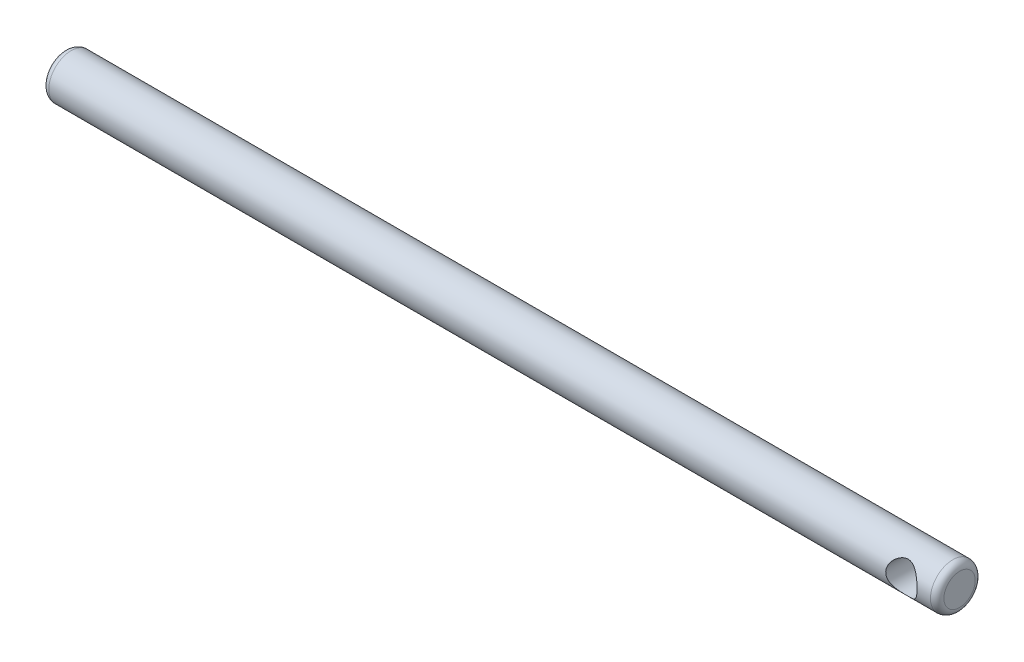
ISO-10303-21;
HEADER;
FILE_DESCRIPTION(('STEP AP214'),'2;1');
FILE_NAME('part.step','',(''),(''),'','','');
FILE_SCHEMA(('AUTOMOTIVE_DESIGN { 1 0 10303 214 1 1 1 1 }'));
ENDSEC;
DATA;
#1=APPLICATION_CONTEXT('core data for automotive mechanical design processes');
#2=APPLICATION_PROTOCOL_DEFINITION('international standard','automotive_design',2000,#1);
#3=PRODUCT_CONTEXT('',#1,'mechanical');
#4=PRODUCT('Part','Part','',(#3));
#5=PRODUCT_RELATED_PRODUCT_CATEGORY('part','',(#4));
#6=PRODUCT_DEFINITION_FORMATION('','',#4);
#7=PRODUCT_DEFINITION_CONTEXT('part definition',#1,'design');
#8=PRODUCT_DEFINITION('design','',#6,#7);
#9=PRODUCT_DEFINITION_SHAPE('','',#8);
#10=(LENGTH_UNIT() NAMED_UNIT(*) SI_UNIT(.MILLI.,.METRE.));
#11=(NAMED_UNIT(*) PLANE_ANGLE_UNIT() SI_UNIT($,.RADIAN.));
#12=(NAMED_UNIT(*) SI_UNIT($,.STERADIAN.) SOLID_ANGLE_UNIT());
#13=UNCERTAINTY_MEASURE_WITH_UNIT(LENGTH_MEASURE(1.E-05),#10,'distance_accuracy_value','');
#14=(GEOMETRIC_REPRESENTATION_CONTEXT(3) GLOBAL_UNCERTAINTY_ASSIGNED_CONTEXT((#13)) GLOBAL_UNIT_ASSIGNED_CONTEXT((#10,
#11,#12)) REPRESENTATION_CONTEXT('',''));
#15=CARTESIAN_POINT('',(0.,0.,0.));
#16=DIRECTION('',(0.,0.,1.));
#17=DIRECTION('',(1.,0.,0.));
#18=AXIS2_PLACEMENT_3D('',#15,#16,#17);
#19=CARTESIAN_POINT('',(0.,0.,0.));
#20=DIRECTION('',(1.,0.,0.));
#21=DIRECTION('',(0.,1.,0.));
#22=AXIS2_PLACEMENT_3D('',#19,#20,#21);
#23=PLANE('',#22);
#24=CARTESIAN_POINT('',(0.,0.,0.));
#25=DIRECTION('',(1.,0.,0.));
#26=DIRECTION('',(0.,1.,0.));
#27=AXIS2_PLACEMENT_3D('',#24,#25,#26);
#28=CIRCLE('',#27,1.75);
#29=CARTESIAN_POINT('',(0.,1.75,0.));
#30=VERTEX_POINT('',#29);
#31=EDGE_CURVE('E51',#30,#30,#28,.T.);
#32=ORIENTED_EDGE('',*,*,#31,.T.);
#33=EDGE_LOOP('',(#32));
#34=FACE_BOUND('',#33,.T.);
#35=ADVANCED_FACE('F35',(#34),#23,.T.);
#36=CARTESIAN_POINT('',(0.,0.,0.));
#37=DIRECTION('',(1.,0.,0.));
#38=DIRECTION('',(0.,1.,0.));
#39=AXIS2_PLACEMENT_3D('',#36,#37,#38);
#40=CYLINDRICAL_SURFACE('',#39,2.5);
#41=CARTESIAN_POINT('',(-4.,-1.79446371347731,-1.74066078861254));
#42=CARTESIAN_POINT('',(-4.08400098508107,-1.79446056427981,-1.74066741532368));
#43=CARTESIAN_POINT('',(-4.16802043931462,-1.78851332237279,-1.74685870961394));
#44=CARTESIAN_POINT('',(-4.33294383729901,-1.76526971947014,-1.77033136062981));
#45=CARTESIAN_POINT('',(-4.4138404296418,-1.74794812493775,-1.78763737302584));
#46=CARTESIAN_POINT('',(-4.56951493609264,-1.70339577608875,-1.83012791171065));
#47=CARTESIAN_POINT('',(-4.64435042320692,-1.67627625136594,-1.85522357363044));
#48=CARTESIAN_POINT('',(-4.78813317548125,-1.61315340674523,-1.9103643650963));
#49=CARTESIAN_POINT('',(-4.85708003011587,-1.57714946815069,-1.94040983929108));
#50=CARTESIAN_POINT('',(-5.00034781373763,-1.48990498728291,-2.00841970521982));
#51=CARTESIAN_POINT('',(-5.07349539939997,-1.43710033629673,-2.04684944489079));
#52=CARTESIAN_POINT('',(-5.21078033482705,-1.32075269863202,-2.1237915928193));
#53=CARTESIAN_POINT('',(-5.27490641048543,-1.25719649037092,-2.16230404451146));
#54=CARTESIAN_POINT('',(-5.40296567220917,-1.10834974260484,-2.24273386208348));
#55=CARTESIAN_POINT('',(-5.46508814900102,-1.02120233502273,-2.28415011223015));
#56=CARTESIAN_POINT('',(-5.57301934718342,-0.834253549675239,-2.35883208495223));
#57=CARTESIAN_POINT('',(-5.61886069496633,-0.734478028684655,-2.39211406586546));
#58=CARTESIAN_POINT('',(-5.68149470864728,-0.553327352491244,-2.43928212722587));
#59=CARTESIAN_POINT('',(-5.70278489971454,-0.474226831110578,-2.45597757593188));
#60=CARTESIAN_POINT('',(-5.73402185773793,-0.312621204975493,-2.4817213010691));
#61=CARTESIAN_POINT('',(-5.74397768187889,-0.230118873285439,-2.49077568190579));
#62=CARTESIAN_POINT('',(-5.75198591183945,-0.0638815863061038,-2.50057320992727));
#63=CARTESIAN_POINT('',(-5.7500151994238,0.0198554488603958,-2.50130020753494));
#64=CARTESIAN_POINT('',(-5.73423806047392,0.185866154847004,-2.4944658623006));
#65=CARTESIAN_POINT('',(-5.72042833343491,0.268139411062456,-2.48690220800982));
#66=CARTESIAN_POINT('',(-5.68219398765831,0.427081065340402,-2.46452905100208));
#67=CARTESIAN_POINT('',(-5.65801877864624,0.503834520040872,-2.44988882818935));
#68=CARTESIAN_POINT('',(-5.60018684940598,0.65218516715366,-2.41463771463776));
#69=CARTESIAN_POINT('',(-5.56652826653279,0.723781343144112,-2.39402565093731));
#70=CARTESIAN_POINT('',(-5.48659822825354,0.868491842334364,-2.34567177814247));
#71=CARTESIAN_POINT('',(-5.43933513459607,0.940874623714963,-2.31738939635087));
#72=CARTESIAN_POINT('',(-5.335751894994,1.07722471101649,-2.25724447950954));
#73=CARTESIAN_POINT('',(-5.27942199458078,1.14118281701279,-2.22537809988763));
#74=CARTESIAN_POINT('',(-5.14786836950174,1.27074600185596,-2.15443273144205));
#75=CARTESIAN_POINT('',(-5.07106700492144,1.33460530109132,-2.11508200296176));
#76=CARTESIAN_POINT('',(-4.90707542037399,1.44892058239309,-2.03846872625847));
#77=CARTESIAN_POINT('',(-4.81988789326222,1.49938002777574,-2.00120564043333));
#78=CARTESIAN_POINT('',(-4.65713907420021,1.57533289712344,-1.94167324434292));
#79=CARTESIAN_POINT('',(-4.58356209549786,1.60390189826128,-1.91793014039964));
#80=CARTESIAN_POINT('',(-4.43145306320948,1.65101413404177,-1.87753051651535));
#81=CARTESIAN_POINT('',(-4.35293058628106,1.66957611817273,-1.86086075628783));
#82=CARTESIAN_POINT('',(-4.19170997459458,1.69560691019814,-1.83718516108711));
#83=CARTESIAN_POINT('',(-4.10897760280311,1.70296146006359,-1.83027891429474));
#84=CARTESIAN_POINT('',(-3.94317097607153,1.70548723919924,-1.82792794991203));
#85=CARTESIAN_POINT('',(-3.8600968567979,1.70066291007603,-1.83247905385296));
#86=CARTESIAN_POINT('',(-3.70820930977384,1.68082997810486,-1.85066047350451));
#87=CARTESIAN_POINT('',(-3.6390186016851,1.66733004453284,-1.86294098658664));
#88=CARTESIAN_POINT('',(-3.50403816283819,1.6324652547244,-1.89356683294562));
#89=CARTESIAN_POINT('',(-3.43825210132993,1.61109210672403,-1.91191855810318));
#90=CARTESIAN_POINT('',(-3.28077034820005,1.54953614514869,-1.96243924395887));
#91=CARTESIAN_POINT('',(-3.19146803919048,1.50523552151598,-1.99704469064909));
#92=CARTESIAN_POINT('',(-3.02257282529334,1.40317389648022,-2.07003715014529));
#93=CARTESIAN_POINT('',(-2.94299936548852,1.34538658837698,-2.10843146782286));
#94=CARTESIAN_POINT('',(-2.7928957792087,1.21620025309535,-2.18554978940748));
#95=CARTESIAN_POINT('',(-2.72256465844527,1.14456492697655,-2.22426634095804));
#96=CARTESIAN_POINT('',(-2.59413851518448,0.989292700934416,-2.29753105377563));
#97=CARTESIAN_POINT('',(-2.53602555111756,0.905673706234847,-2.33208529480363));
#98=CARTESIAN_POINT('',(-2.44223142992906,0.741975516066396,-2.38866473361179));
#99=CARTESIAN_POINT('',(-2.40444480691776,0.663495733981465,-2.41181153657269));
#100=CARTESIAN_POINT('',(-2.34037477182328,0.500256964121908,-2.4508708176133));
#101=CARTESIAN_POINT('',(-2.31408438195674,0.415501821891154,-2.46678768422194));
#102=CARTESIAN_POINT('',(-2.27430272688605,0.241317319992296,-2.48988345330244));
#103=CARTESIAN_POINT('',(-2.26088540426303,0.151864033227344,-2.49701194140647));
#104=CARTESIAN_POINT('',(-2.24802501832628,-0.028281149564237,-2.50146055336836));
#105=CARTESIAN_POINT('',(-2.24857650413177,-0.118972548650019,-2.49878450348229));
#106=CARTESIAN_POINT('',(-2.26285949256849,-0.289650200968992,-2.48449748917116));
#107=CARTESIAN_POINT('',(-2.27531226870285,-0.36982407856609,-2.4737748871161));
#108=CARTESIAN_POINT('',(-2.31087611828672,-0.526439802759659,-2.44524036559677));
#109=CARTESIAN_POINT('',(-2.33398921930748,-0.602880936336121,-2.42742709759115));
#110=CARTESIAN_POINT('',(-2.39080323386534,-0.753015971549397,-2.38521782498376));
#111=CARTESIAN_POINT('',(-2.42484651008379,-0.826519986865232,-2.36061318470838));
#112=CARTESIAN_POINT('',(-2.5019677941032,-0.966715695996432,-2.30675285942004));
#113=CARTESIAN_POINT('',(-2.54504754955409,-1.03340606834158,-2.27749627498896));
#114=CARTESIAN_POINT('',(-2.64652453921162,-1.1692356906958,-2.21121043446327));
#115=CARTESIAN_POINT('',(-2.70626361794323,-1.23712700402676,-2.17368114901002));
#116=CARTESIAN_POINT('',(-2.83526808263681,-1.36257020897255,-2.09733447419809));
#117=CARTESIAN_POINT('',(-2.90455327764108,-1.42010001136605,-2.05851453713098));
#118=CARTESIAN_POINT('',(-3.06347200550121,-1.53237955526108,-1.97670057741696));
#119=CARTESIAN_POINT('',(-3.15459200750299,-1.58526879453933,-1.93401039706163));
#120=CARTESIAN_POINT('',(-3.34772050591772,-1.67473883809054,-1.85707785784884));
#121=CARTESIAN_POINT('',(-3.44969480667087,-1.71136908397573,-1.82281003147274));
#122=CARTESIAN_POINT('',(-3.62726530873244,-1.75684151009074,-1.77880927807464));
#123=CARTESIAN_POINT('',(-3.70043849135375,-1.77086671559527,-1.76471054446928));
#124=CARTESIAN_POINT('',(-3.8490723032766,-1.78967114841716,-1.74564130307461));
#125=CARTESIAN_POINT('',(-3.92452869725181,-1.79446654289696,-1.74065483479518));
#126=CARTESIAN_POINT('',(-4.,-1.79446371347731,-1.74066078861254));
#127=B_SPLINE_CURVE_WITH_KNOTS('',3,(#41,#42,#43,#44,#45,#46,#47,#48,#49,#50,#51,#52,#53,#54,
#55,#56,#57,#58,#59,#60,#61,#62,#63,#64,#65,#66,#67,#68,#69,#70,#71,#72,#73,#74,#75,#76,#77,#78,
#79,#80,#81,#82,#83,#84,#85,#86,#87,#88,#89,#90,#91,#92,#93,#94,#95,#96,#97,#98,#99,#100,#101,
#102,#103,#104,#105,#106,#107,#108,#109,#110,#111,#112,#113,#114,#115,#116,#117,#118,#119,#120,
#121,#122,#123,#124,#125,#126),.UNSPECIFIED.,.T.,.F.,(4,2,2,2,2,2,2,2,2,2,2,2,2,2,2,2,2,2,2,2,2,
2,2,2,2,2,2,2,2,2,2,2,2,2,2,2,2,2,2,2,2,2,4),(0.,0.251644352862942,0.50384886309281,
0.753275865950744,1.00272024341801,1.29584807815701,1.5893390387642,1.93170814842452,
2.27338724778375,2.5231113369524,2.77263573360096,3.02264395964272,3.2727219061639,
3.51709337531476,3.76151287536606,4.03336573621142,4.30551304756611,4.62626324788575,
4.946930466484,5.1933274119763,5.43926108098981,5.68768561592644,5.93601956414819,
6.14983844698565,6.36388316239657,6.67875939439454,6.9942550244426,7.31570467879081,
7.63667895652618,7.90595122268594,8.17505982302549,8.44570508287666,8.71624473369787,
8.96064229991227,9.20508636920793,9.45808878225991,9.71114017102308,10.003763719812,
10.2970038996666,10.6363668560714,10.9746906604828,11.2011794654439,11.427271184743),.UNSPECIFIED.);
#128=CARTESIAN_POINT('',(-4.,-1.79446371347731,-1.74066078861254));
#129=VERTEX_POINT('',#128);
#130=EDGE_CURVE('E39',#129,#129,#127,.T.);
#131=ORIENTED_EDGE('',*,*,#130,.F.);
#132=EDGE_LOOP('',(#131));
#133=FACE_BOUND('',#132,.T.);
#134=CARTESIAN_POINT('',(-4.,-1.70442334736508,1.82891800061043));
#135=CARTESIAN_POINT('',(-3.91599901491893,-1.70441986807588,1.82892446012219));
#136=CARTESIAN_POINT('',(-3.83197956068538,-1.69816804509084,1.83480804072016));
#137=CARTESIAN_POINT('',(-3.66705616270099,-1.67377058916623,1.8570789761746));
#138=CARTESIAN_POINT('',(-3.5861595703582,-1.65559851172365,1.87348968315562));
#139=CARTESIAN_POINT('',(-3.43048506390736,-1.60896059048906,1.9136800049832));
#140=CARTESIAN_POINT('',(-3.35564957679308,-1.58061031508133,1.93737647629624));
#141=CARTESIAN_POINT('',(-3.21186682451875,-1.51478773125804,1.98926470092686));
#142=CARTESIAN_POINT('',(-3.14291996988413,-1.47731478755662,2.01745676726223));
#143=CARTESIAN_POINT('',(-2.99965218626237,-1.38675242795396,2.0809815681571));
#144=CARTESIAN_POINT('',(-2.92650460060003,-1.33207743117422,2.11670020172679));
#145=CARTESIAN_POINT('',(-2.78921966517295,-1.21199859029344,2.18767864134575));
#146=CARTESIAN_POINT('',(-2.72509358951457,-1.14658153923429,2.22293782418644));
#147=CARTESIAN_POINT('',(-2.59703432779082,-0.993869081648104,2.29576100163149));
#148=CARTESIAN_POINT('',(-2.53491185099898,-0.904744433054981,2.33273090070691));
#149=CARTESIAN_POINT('',(-2.42698065281658,-0.71426818044026,2.3978925656827));
#150=CARTESIAN_POINT('',(-2.38113930503366,-0.612941580619643,2.42610187285682));
#151=CARTESIAN_POINT('',(-2.31850529135272,-0.42964322294008,2.46407693796281));
#152=CARTESIAN_POINT('',(-2.29721510028546,-0.349801567234564,2.47676317083116));
#153=CARTESIAN_POINT('',(-2.26597814226207,-0.187103547007411,2.49432654170974));
#154=CARTESIAN_POINT('',(-2.25602231812111,-0.104249644259843,2.49920991617093));
#155=CARTESIAN_POINT('',(-2.24801408816055,0.0622701926655552,2.50061385631215));
#156=CARTESIAN_POINT('',(-2.2499848005762,0.145937389867895,2.49711818809249));
#157=CARTESIAN_POINT('',(-2.26576193952608,0.311392410519923,2.48192282965673));
#158=CARTESIAN_POINT('',(-2.27957166656509,0.393179703356702,2.47022085183438));
#159=CARTESIAN_POINT('',(-2.31780601234169,0.550791247287247,2.43986284071815));
#160=CARTESIAN_POINT('',(-2.34198122135376,0.626708981376735,2.42137158377923));
#161=CARTESIAN_POINT('',(-2.39981315059402,0.773093723521892,2.37868595654352));
#162=CARTESIAN_POINT('',(-2.43347173346722,0.843559657311507,2.35449046602143));
#163=CARTESIAN_POINT('',(-2.51340177174646,0.985648283509578,2.29890226677648));
#164=CARTESIAN_POINT('',(-2.56066486540393,1.05651311055359,2.26700655471012));
#165=CARTESIAN_POINT('',(-2.664248105006,1.18965749202501,2.20006381043133));
#166=CARTESIAN_POINT('',(-2.72057800541922,1.25192766439715,2.16501340236541));
#167=CARTESIAN_POINT('',(-2.85213163049826,1.37774925185417,2.08762611464722));
#168=CARTESIAN_POINT('',(-2.92893299507856,1.43954340728005,2.04510585728718));
#169=CARTESIAN_POINT('',(-3.09292457962601,1.54985072540518,1.96282661765557));
#170=CARTESIAN_POINT('',(-3.18011210673778,1.59836731991218,1.9230669238567));
#171=CARTESIAN_POINT('',(-3.34286092579979,1.67122217352537,1.85978094712082));
#172=CARTESIAN_POINT('',(-3.41643790450214,1.69855779475734,1.83462768445497));
#173=CARTESIAN_POINT('',(-3.56854693679052,1.74357330264327,1.79190419653555));
#174=CARTESIAN_POINT('',(-3.64706941371894,1.76127124741033,1.77431980254703));
#175=CARTESIAN_POINT('',(-3.80829002540542,1.78607529100711,1.74936193078625));
#176=CARTESIAN_POINT('',(-3.89102239719689,1.79307229801605,1.74209367505346));
#177=CARTESIAN_POINT('',(-4.05682902392847,1.79547633728485,1.73961835912111));
#178=CARTESIAN_POINT('',(-4.1399031432021,1.79088759483836,1.74440690183576));
#179=CARTESIAN_POINT('',(-4.29179069022616,1.7719965313443,1.76356510976819));
#180=CARTESIAN_POINT('',(-4.3609813983149,1.75913290842078,1.77651062687994));
#181=CARTESIAN_POINT('',(-4.49596183716181,1.72585650990614,1.80885529159431));
#182=CARTESIAN_POINT('',(-4.56174789867006,1.70543577535318,1.82826124099191));
#183=CARTESIAN_POINT('',(-4.71922965179995,1.64650518026465,1.881821123995));
#184=CARTESIAN_POINT('',(-4.80853196080951,1.6040055858824,1.91861605125707));
#185=CARTESIAN_POINT('',(-4.97742717470666,1.50575379120753,1.99666129000621));
#186=CARTESIAN_POINT('',(-5.05700063451148,1.44997568595688,2.03792022337092));
#187=CARTESIAN_POINT('',(-5.20710422079129,1.32484168846516,2.12145361441467));
#188=CARTESIAN_POINT('',(-5.27743534155473,1.25524942206881,2.16373254261695));
#189=CARTESIAN_POINT('',(-5.40586148481552,1.10386842191354,2.2447323890138));
#190=CARTESIAN_POINT('',(-5.46397444888244,1.02209787712901,2.28345847651602));
#191=CARTESIAN_POINT('',(-5.55776857007094,0.86146041266644,2.34821907697115));
#192=CARTESIAN_POINT('',(-5.59555519308224,0.784247419935574,2.37529313165368));
#193=CARTESIAN_POINT('',(-5.65962522817672,0.6231854837595,2.42253269278505));
#194=CARTESIAN_POINT('',(-5.68591561804326,0.539340602222631,2.44270238830235));
#195=CARTESIAN_POINT('',(-5.72569727311395,0.366542027115136,2.47455058592785));
#196=CARTESIAN_POINT('',(-5.73911459573697,0.277561895152595,2.48617994410579));
#197=CARTESIAN_POINT('',(-5.75197498167372,0.0978700922155549,2.49970521632618));
#198=CARTESIAN_POINT('',(-5.75142349586823,0.00715911045696446,2.50160492670465));
#199=CARTESIAN_POINT('',(-5.73714050743151,-0.164021789755285,2.49594107805145));
#200=CARTESIAN_POINT('',(-5.72468773129715,-0.244634305705772,2.48927421102726));
#201=CARTESIAN_POINT('',(-5.68912388171328,-0.402489472411368,2.46867201873224));
#202=CARTESIAN_POINT('',(-5.66601078069252,-0.479731479042184,2.45473531068694));
#203=CARTESIAN_POINT('',(-5.60919676613466,-0.631803633662129,2.42014902320499));
#204=CARTESIAN_POINT('',(-5.57515348991621,-0.706454655527032,2.3992814999893));
#205=CARTESIAN_POINT('',(-5.4980322058968,-0.849187531299879,2.35255786921666));
#206=CARTESIAN_POINT('',(-5.45495245044591,-0.917268110763809,2.32670079676128));
#207=CARTESIAN_POINT('',(-5.35347546078838,-1.05626690516102,2.26734732913546));
#208=CARTESIAN_POINT('',(-5.29373638205677,-1.12596398026059,2.23328862371381));
#209=CARTESIAN_POINT('',(-5.1647319173632,-1.25509679956947,2.16336346801681));
#210=CARTESIAN_POINT('',(-5.09544672235892,-1.3145106110959,2.12749335960837));
#211=CARTESIAN_POINT('',(-4.93652799449879,-1.43077215217487,2.05144420414097));
#212=CARTESIAN_POINT('',(-4.84540799249702,-1.48574642684511,2.01147481266847));
#213=CARTESIAN_POINT('',(-4.65227949408229,-1.57898137016853,1.93915089113303));
#214=CARTESIAN_POINT('',(-4.55030519332914,-1.61729270154474,1.90677341861997));
#215=CARTESIAN_POINT('',(-4.37273469126756,-1.66492566993256,1.86512118988069));
#216=CARTESIAN_POINT('',(-4.29956150864625,-1.67964385018729,1.85174748999215));
#217=CARTESIAN_POINT('',(-4.1509276967234,-1.69938577626166,1.83365055610832));
#218=CARTESIAN_POINT('',(-4.07547130274819,-1.70442647335804,1.82891219701459));
#219=CARTESIAN_POINT('',(-4.,-1.70442334736508,1.82891800061043));
#220=B_SPLINE_CURVE_WITH_KNOTS('',3,(#134,#135,#136,#137,#138,#139,#140,#141,#142,#143,#144,
#145,#146,#147,#148,#149,#150,#151,#152,#153,#154,#155,#156,#157,#158,#159,#160,#161,#162,#163,
#164,#165,#166,#167,#168,#169,#170,#171,#172,#173,#174,#175,#176,#177,#178,#179,#180,#181,#182,
#183,#184,#185,#186,#187,#188,#189,#190,#191,#192,#193,#194,#195,#196,#197,#198,#199,#200,#201,
#202,#203,#204,#205,#206,#207,#208,#209,#210,#211,#212,#213,#214,#215,#216,#217,#218,#219),
.UNSPECIFIED.,.T.,.F.,(4,2,2,2,2,2,2,2,2,2,2,2,2,2,2,2,2,2,2,2,2,2,2,2,2,2,2,2,2,2,2,2,2,2,2,2,
2,2,2,2,2,2,4),(0.,0.251644352862942,0.503848863092811,0.753275865950744,1.00272024341801,
1.29584807815701,1.5893390387642,1.93170814842452,2.27338724778375,2.5231113369524,
2.77263573360096,3.02264395964272,3.2727219061639,3.51709337531476,3.76151287536606,
4.03336573621143,4.30551304756612,4.62626324788575,4.946930466484,5.1933274119763,
5.43926108098981,5.68768561592644,5.93601956414819,6.14983844698565,6.36388316239657,
6.67875939439453,6.9942550244426,7.3157046787908,7.63667895652618,7.90595122268594,
8.17505982302549,8.44570508287666,8.71624473369787,8.96064229991227,9.20508636920793,
9.45808878225991,9.71114017102308,10.003763719812,10.2970038996666,10.6363668560714,
10.9746906604828,11.2011794654439,11.427271184743),.UNSPECIFIED.);
#221=CARTESIAN_POINT('',(-4.,-1.70442334736508,1.82891800061043));
#222=VERTEX_POINT('',#221);
#223=EDGE_CURVE('E11',#222,#222,#220,.T.);
#224=ORIENTED_EDGE('',*,*,#223,.F.);
#225=EDGE_LOOP('',(#224));
#226=FACE_BOUND('',#225,.T.);
#227=CARTESIAN_POINT('',(-0.75,0.,0.));
#228=DIRECTION('',(1.,0.,0.));
#229=DIRECTION('',(0.,1.,0.));
#230=AXIS2_PLACEMENT_3D('',#227,#228,#229);
#231=CIRCLE('',#230,2.5);
#232=CARTESIAN_POINT('',(-0.75,2.5,0.));
#233=VERTEX_POINT('',#232);
#234=EDGE_CURVE('E47',#233,#233,#231,.F.);
#235=ORIENTED_EDGE('',*,*,#234,.T.);
#236=EDGE_LOOP('',(#235));
#237=FACE_BOUND('',#236,.T.);
#238=CARTESIAN_POINT('',(-99.25,0.,0.));
#239=DIRECTION('',(-1.,0.,0.));
#240=DIRECTION('',(0.,-1.,0.));
#241=AXIS2_PLACEMENT_3D('',#238,#239,#240);
#242=CIRCLE('',#241,2.5);
#243=CARTESIAN_POINT('',(-99.25,-2.50000000000002,0.));
#244=VERTEX_POINT('',#243);
#245=EDGE_CURVE('E84',#244,#244,#242,.F.);
#246=ORIENTED_EDGE('',*,*,#245,.T.);
#247=EDGE_LOOP('',(#246));
#248=FACE_BOUND('',#247,.T.);
#249=ADVANCED_FACE('F56',(#133,#226,#237,#248),#40,.T.);
#250=CARTESIAN_POINT('',(-100.,0.,0.));
#251=DIRECTION('',(-1.,0.,0.));
#252=DIRECTION('',(0.,-1.,0.));
#253=AXIS2_PLACEMENT_3D('',#250,#251,#252);
#254=PLANE('',#253);
#255=CARTESIAN_POINT('',(-100.,0.,0.));
#256=DIRECTION('',(-1.,0.,0.));
#257=DIRECTION('',(0.,-1.,0.));
#258=AXIS2_PLACEMENT_3D('',#255,#256,#257);
#259=CIRCLE('',#258,1.75);
#260=CARTESIAN_POINT('',(-100.,-1.75000000000002,0.));
#261=VERTEX_POINT('',#260);
#262=EDGE_CURVE('E83',#261,#261,#259,.T.);
#263=ORIENTED_EDGE('',*,*,#262,.T.);
#264=EDGE_LOOP('',(#263));
#265=FACE_BOUND('',#264,.T.);
#266=ADVANCED_FACE('F64',(#265),#254,.T.);
#267=CARTESIAN_POINT('',(-99.25,0.,0.));
#268=DIRECTION('',(-1.,0.,0.));
#269=DIRECTION('',(0.,-1.,0.));
#270=AXIS2_PLACEMENT_3D('',#267,#268,#269);
#271=TOROIDAL_SURFACE('',#270,1.75,0.75);
#272=ORIENTED_EDGE('',*,*,#262,.F.);
#273=EDGE_LOOP('',(#272));
#274=FACE_BOUND('',#273,.T.);
#275=ORIENTED_EDGE('',*,*,#245,.F.);
#276=EDGE_LOOP('',(#275));
#277=FACE_BOUND('',#276,.T.);
#278=ADVANCED_FACE('F67',(#274,#277),#271,.T.);
#279=CARTESIAN_POINT('',(-0.75,0.,0.));
#280=DIRECTION('',(1.,0.,0.));
#281=DIRECTION('',(0.,1.,0.));
#282=AXIS2_PLACEMENT_3D('',#279,#280,#281);
#283=TOROIDAL_SURFACE('',#282,1.75,0.75);
#284=ORIENTED_EDGE('',*,*,#234,.F.);
#285=EDGE_LOOP('',(#284));
#286=FACE_BOUND('',#285,.T.);
#287=ORIENTED_EDGE('',*,*,#31,.F.);
#288=EDGE_LOOP('',(#287));
#289=FACE_BOUND('',#288,.T.);
#290=ADVANCED_FACE('F37',(#286,#289),#283,.T.);
#291=CARTESIAN_POINT('',(-4.,0.0630408657127762,2.49920504345886));
#292=DIRECTION('',(0.,0.0252163462851107,0.999682017383543));
#293=DIRECTION('',(0.,-0.999682017383543,0.0252163462851107));
#294=AXIS2_PLACEMENT_3D('',#291,#292,#293);
#295=CYLINDRICAL_SURFACE('',#294,1.74999999999999);
#296=ORIENTED_EDGE('',*,*,#130,.T.);
#297=EDGE_LOOP('',(#296));
#298=FACE_BOUND('',#297,.T.);
#299=ORIENTED_EDGE('',*,*,#223,.T.);
#300=EDGE_LOOP('',(#299));
#301=FACE_BOUND('',#300,.T.);
#302=ADVANCED_FACE('F60',(#298,#301),#295,.F.);
#303=CLOSED_SHELL('',(#35,#249,#266,#278,#290,#302));
#304=MANIFOLD_SOLID_BREP('B2',#303);
#305=ADVANCED_BREP_SHAPE_REPRESENTATION('',(#18,#304),#14);
#306=SHAPE_DEFINITION_REPRESENTATION(#9,#305);
ENDSEC;
END-ISO-10303-21;
